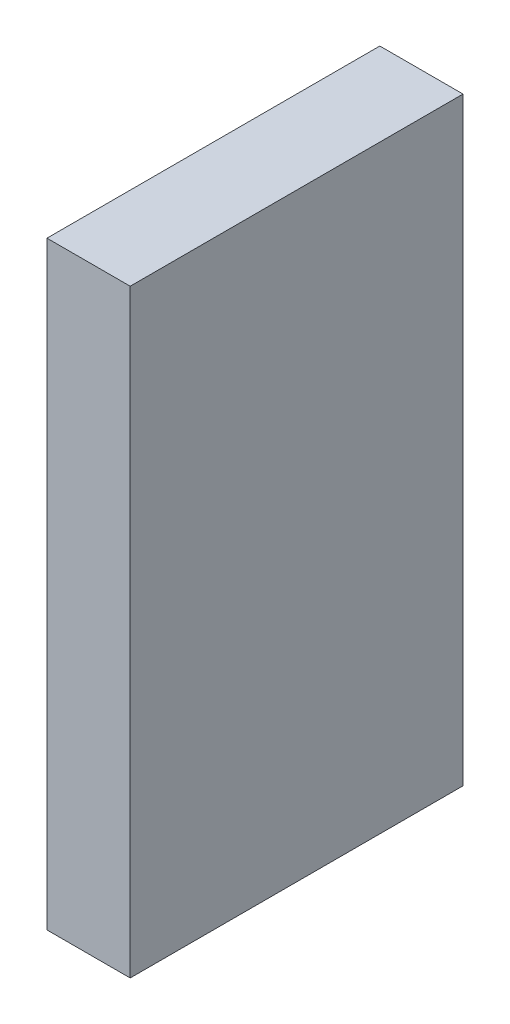
ISO-10303-21;
HEADER;
FILE_DESCRIPTION(('STEP AP214'),'2;1');
FILE_NAME('part.step','',(''),(''),'','','');
FILE_SCHEMA(('AUTOMOTIVE_DESIGN { 1 0 10303 214 1 1 1 1 }'));
ENDSEC;
DATA;
#1=APPLICATION_CONTEXT('core data for automotive mechanical design processes');
#2=APPLICATION_PROTOCOL_DEFINITION('international standard','automotive_design',2000,#1);
#3=PRODUCT_CONTEXT('',#1,'mechanical');
#4=PRODUCT('Part','Part','',(#3));
#5=PRODUCT_RELATED_PRODUCT_CATEGORY('part','',(#4));
#6=PRODUCT_DEFINITION_FORMATION('','',#4);
#7=PRODUCT_DEFINITION_CONTEXT('part definition',#1,'design');
#8=PRODUCT_DEFINITION('design','',#6,#7);
#9=PRODUCT_DEFINITION_SHAPE('','',#8);
#10=(LENGTH_UNIT() NAMED_UNIT(*) SI_UNIT(.MILLI.,.METRE.));
#11=(NAMED_UNIT(*) PLANE_ANGLE_UNIT() SI_UNIT($,.RADIAN.));
#12=(NAMED_UNIT(*) SI_UNIT($,.STERADIAN.) SOLID_ANGLE_UNIT());
#13=UNCERTAINTY_MEASURE_WITH_UNIT(LENGTH_MEASURE(1.E-05),#10,'distance_accuracy_value','');
#14=(GEOMETRIC_REPRESENTATION_CONTEXT(3) GLOBAL_UNCERTAINTY_ASSIGNED_CONTEXT((#13)) GLOBAL_UNIT_ASSIGNED_CONTEXT((#10,
#11,#12)) REPRESENTATION_CONTEXT('',''));
#15=CARTESIAN_POINT('',(0.,0.,0.));
#16=DIRECTION('',(0.,0.,1.));
#17=DIRECTION('',(1.,0.,0.));
#18=AXIS2_PLACEMENT_3D('',#15,#16,#17);
#19=CARTESIAN_POINT('',(1.25,18.,-5.));
#20=DIRECTION('',(-1.,0.,0.));
#21=DIRECTION('',(0.,0.,1.));
#22=AXIS2_PLACEMENT_3D('',#19,#20,#21);
#23=PLANE('',#22);
#24=DIRECTION('',(0.,0.,-1.));
#25=VECTOR('',#24,1.);
#26=CARTESIAN_POINT('',(1.25,0.,-5.));
#27=LINE('',#26,#25);
#28=CARTESIAN_POINT('',(1.25,0.,5.));
#29=VERTEX_POINT('',#28);
#30=CARTESIAN_POINT('',(1.25,0.,-5.));
#31=VERTEX_POINT('',#30);
#32=EDGE_CURVE('E107',#29,#31,#27,.T.);
#33=ORIENTED_EDGE('',*,*,#32,.T.);
#34=DIRECTION('',(0.,-1.,0.));
#35=VECTOR('',#34,1.);
#36=CARTESIAN_POINT('',(1.25,18.,-5.));
#37=LINE('',#36,#35);
#38=CARTESIAN_POINT('',(1.25,18.,-5.));
#39=VERTEX_POINT('',#38);
#40=EDGE_CURVE('E11',#39,#31,#37,.T.);
#41=ORIENTED_EDGE('',*,*,#40,.F.);
#42=DIRECTION('',(0.,0.,-1.));
#43=VECTOR('',#42,1.);
#44=CARTESIAN_POINT('',(1.25,18.,-5.));
#45=LINE('',#44,#43);
#46=CARTESIAN_POINT('',(1.25,18.,5.));
#47=VERTEX_POINT('',#46);
#48=EDGE_CURVE('E91',#47,#39,#45,.T.);
#49=ORIENTED_EDGE('',*,*,#48,.F.);
#50=DIRECTION('',(0.,-1.,0.));
#51=VECTOR('',#50,1.);
#52=CARTESIAN_POINT('',(1.25,18.,5.));
#53=LINE('',#52,#51);
#54=EDGE_CURVE('E103',#47,#29,#53,.T.);
#55=ORIENTED_EDGE('',*,*,#54,.T.);
#56=EDGE_LOOP('',(#33,#41,#49,#55));
#57=FACE_BOUND('',#56,.T.);
#58=ADVANCED_FACE('F39',(#57),#23,.F.);
#59=CARTESIAN_POINT('',(-1.25,18.,-5.));
#60=DIRECTION('',(0.,0.,1.));
#61=DIRECTION('',(1.,0.,0.));
#62=AXIS2_PLACEMENT_3D('',#59,#60,#61);
#63=PLANE('',#62);
#64=DIRECTION('',(-1.,0.,0.));
#65=VECTOR('',#64,1.);
#66=CARTESIAN_POINT('',(-1.25,0.,-5.));
#67=LINE('',#66,#65);
#68=CARTESIAN_POINT('',(-1.25,0.,-5.));
#69=VERTEX_POINT('',#68);
#70=EDGE_CURVE('E96',#31,#69,#67,.T.);
#71=ORIENTED_EDGE('',*,*,#70,.T.);
#72=DIRECTION('',(0.,-1.,0.));
#73=VECTOR('',#72,1.);
#74=CARTESIAN_POINT('',(-1.25,18.,-5.));
#75=LINE('',#74,#73);
#76=CARTESIAN_POINT('',(-1.25,18.,-5.));
#77=VERTEX_POINT('',#76);
#78=EDGE_CURVE('E48',#77,#69,#75,.T.);
#79=ORIENTED_EDGE('',*,*,#78,.F.);
#80=DIRECTION('',(-1.,0.,0.));
#81=VECTOR('',#80,1.);
#82=CARTESIAN_POINT('',(-1.25,18.,-5.));
#83=LINE('',#82,#81);
#84=EDGE_CURVE('E86',#39,#77,#83,.T.);
#85=ORIENTED_EDGE('',*,*,#84,.F.);
#86=ORIENTED_EDGE('',*,*,#40,.T.);
#87=EDGE_LOOP('',(#71,#79,#85,#86));
#88=FACE_BOUND('',#87,.T.);
#89=ADVANCED_FACE('F95',(#88),#63,.F.);
#90=CARTESIAN_POINT('',(-1.25,18.,-5.));
#91=DIRECTION('',(1.,0.,0.));
#92=DIRECTION('',(0.,0.,-1.));
#93=AXIS2_PLACEMENT_3D('',#90,#91,#92);
#94=PLANE('',#93);
#95=DIRECTION('',(0.,0.,1.));
#96=VECTOR('',#95,1.);
#97=CARTESIAN_POINT('',(-1.25,0.,-5.));
#98=LINE('',#97,#96);
#99=CARTESIAN_POINT('',(-1.25,0.,5.));
#100=VERTEX_POINT('',#99);
#101=EDGE_CURVE('E73',#69,#100,#98,.T.);
#102=ORIENTED_EDGE('',*,*,#101,.T.);
#103=DIRECTION('',(0.,-1.,0.));
#104=VECTOR('',#103,1.);
#105=CARTESIAN_POINT('',(-1.25,18.,5.));
#106=LINE('',#105,#104);
#107=CARTESIAN_POINT('',(-1.25,18.,5.));
#108=VERTEX_POINT('',#107);
#109=EDGE_CURVE('E98',#108,#100,#106,.T.);
#110=ORIENTED_EDGE('',*,*,#109,.F.);
#111=DIRECTION('',(0.,0.,1.));
#112=VECTOR('',#111,1.);
#113=CARTESIAN_POINT('',(-1.25,18.,-5.));
#114=LINE('',#113,#112);
#115=EDGE_CURVE('E89',#77,#108,#114,.T.);
#116=ORIENTED_EDGE('',*,*,#115,.F.);
#117=ORIENTED_EDGE('',*,*,#78,.T.);
#118=EDGE_LOOP('',(#102,#110,#116,#117));
#119=FACE_BOUND('',#118,.T.);
#120=ADVANCED_FACE('F99',(#119),#94,.F.);
#121=CARTESIAN_POINT('',(-1.25,18.,5.));
#122=DIRECTION('',(0.,0.,-1.));
#123=DIRECTION('',(-1.,0.,0.));
#124=AXIS2_PLACEMENT_3D('',#121,#122,#123);
#125=PLANE('',#124);
#126=DIRECTION('',(1.,0.,0.));
#127=VECTOR('',#126,1.);
#128=CARTESIAN_POINT('',(-1.25,0.,5.));
#129=LINE('',#128,#127);
#130=EDGE_CURVE('E79',#100,#29,#129,.T.);
#131=ORIENTED_EDGE('',*,*,#130,.T.);
#132=ORIENTED_EDGE('',*,*,#54,.F.);
#133=DIRECTION('',(1.,0.,0.));
#134=VECTOR('',#133,1.);
#135=CARTESIAN_POINT('',(-1.25,18.,5.));
#136=LINE('',#135,#134);
#137=EDGE_CURVE('E56',#108,#47,#136,.T.);
#138=ORIENTED_EDGE('',*,*,#137,.F.);
#139=ORIENTED_EDGE('',*,*,#109,.T.);
#140=EDGE_LOOP('',(#131,#132,#138,#139));
#141=FACE_BOUND('',#140,.T.);
#142=ADVANCED_FACE('F120',(#141),#125,.F.);
#143=CARTESIAN_POINT('',(0.,18.,0.));
#144=DIRECTION('',(0.,1.,0.));
#145=DIRECTION('',(0.,0.,1.));
#146=AXIS2_PLACEMENT_3D('',#143,#144,#145);
#147=PLANE('',#146);
#148=ORIENTED_EDGE('',*,*,#48,.T.);
#149=ORIENTED_EDGE('',*,*,#84,.T.);
#150=ORIENTED_EDGE('',*,*,#115,.T.);
#151=ORIENTED_EDGE('',*,*,#137,.T.);
#152=EDGE_LOOP('',(#148,#149,#150,#151));
#153=FACE_BOUND('',#152,.T.);
#154=ADVANCED_FACE('F87',(#153),#147,.T.);
#155=CARTESIAN_POINT('',(0.,0.,0.));
#156=DIRECTION('',(0.,1.,0.));
#157=DIRECTION('',(0.,0.,1.));
#158=AXIS2_PLACEMENT_3D('',#155,#156,#157);
#159=PLANE('',#158);
#160=ORIENTED_EDGE('',*,*,#32,.F.);
#161=ORIENTED_EDGE('',*,*,#130,.F.);
#162=ORIENTED_EDGE('',*,*,#101,.F.);
#163=ORIENTED_EDGE('',*,*,#70,.F.);
#164=EDGE_LOOP('',(#160,#161,#162,#163));
#165=FACE_BOUND('',#164,.T.);
#166=ADVANCED_FACE('F123',(#165),#159,.F.);
#167=CLOSED_SHELL('',(#58,#89,#120,#142,#154,#166));
#168=MANIFOLD_SOLID_BREP('B2',#167);
#169=ADVANCED_BREP_SHAPE_REPRESENTATION('',(#18,#168),#14);
#170=SHAPE_DEFINITION_REPRESENTATION(#9,#169);
ENDSEC;
END-ISO-10303-21;
